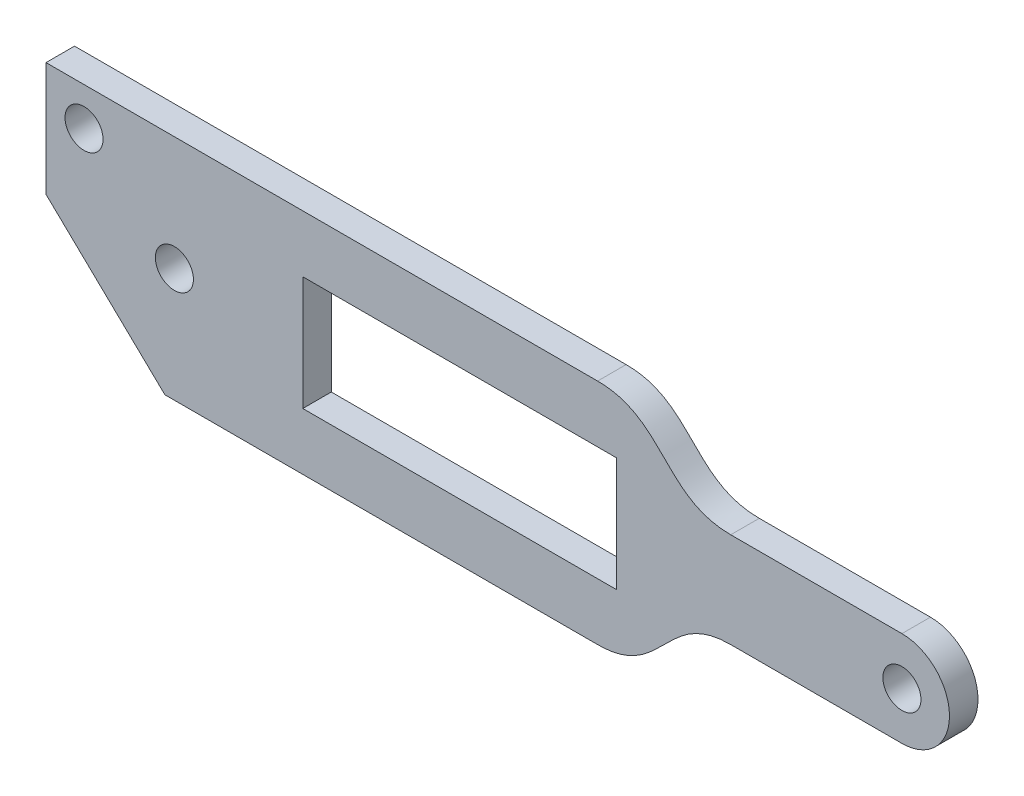
ISO-10303-21;
HEADER;
FILE_DESCRIPTION(('STEP AP214'),'2;1');
FILE_NAME('part.step','',(''),(''),'','','');
FILE_SCHEMA(('AUTOMOTIVE_DESIGN { 1 0 10303 214 1 1 1 1 }'));
ENDSEC;
DATA;
#1=APPLICATION_CONTEXT('core data for automotive mechanical design processes');
#2=APPLICATION_PROTOCOL_DEFINITION('international standard','automotive_design',2000,#1);
#3=PRODUCT_CONTEXT('',#1,'mechanical');
#4=PRODUCT('Part','Part','',(#3));
#5=PRODUCT_RELATED_PRODUCT_CATEGORY('part','',(#4));
#6=PRODUCT_DEFINITION_FORMATION('','',#4);
#7=PRODUCT_DEFINITION_CONTEXT('part definition',#1,'design');
#8=PRODUCT_DEFINITION('design','',#6,#7);
#9=PRODUCT_DEFINITION_SHAPE('','',#8);
#10=(LENGTH_UNIT() NAMED_UNIT(*) SI_UNIT(.MILLI.,.METRE.));
#11=(NAMED_UNIT(*) PLANE_ANGLE_UNIT() SI_UNIT($,.RADIAN.));
#12=(NAMED_UNIT(*) SI_UNIT($,.STERADIAN.) SOLID_ANGLE_UNIT());
#13=UNCERTAINTY_MEASURE_WITH_UNIT(LENGTH_MEASURE(1.E-05),#10,'distance_accuracy_value','');
#14=(GEOMETRIC_REPRESENTATION_CONTEXT(3) GLOBAL_UNCERTAINTY_ASSIGNED_CONTEXT((#13)) GLOBAL_UNIT_ASSIGNED_CONTEXT((#10,
#11,#12)) REPRESENTATION_CONTEXT('',''));
#15=CARTESIAN_POINT('',(0.,0.,0.));
#16=DIRECTION('',(0.,0.,1.));
#17=DIRECTION('',(1.,0.,0.));
#18=AXIS2_PLACEMENT_3D('',#15,#16,#17);
#19=CARTESIAN_POINT('',(0.,5.99999999999999,3.));
#20=DIRECTION('',(0.,1.,0.));
#21=DIRECTION('',(0.,0.,1.));
#22=AXIS2_PLACEMENT_3D('',#19,#20,#21);
#23=PLANE('',#22);
#24=DIRECTION('',(1.,0.,0.));
#25=VECTOR('',#24,1.);
#26=CARTESIAN_POINT('',(0.,5.99999999999999,0.));
#27=LINE('',#26,#25);
#28=CARTESIAN_POINT('',(-20.5,5.99999999999999,0.));
#29=VERTEX_POINT('',#28);
#30=CARTESIAN_POINT('',(12.5,5.99999999999999,0.));
#31=VERTEX_POINT('',#30);
#32=EDGE_CURVE('E206',#29,#31,#27,.T.);
#33=ORIENTED_EDGE('',*,*,#32,.T.);
#34=DIRECTION('',(0.,0.,-1.));
#35=VECTOR('',#34,1.);
#36=CARTESIAN_POINT('',(12.5,5.99999999999999,3.));
#37=LINE('',#36,#35);
#38=CARTESIAN_POINT('',(12.5,5.99999999999999,3.));
#39=VERTEX_POINT('',#38);
#40=EDGE_CURVE('E11',#39,#31,#37,.T.);
#41=ORIENTED_EDGE('',*,*,#40,.F.);
#42=DIRECTION('',(1.,0.,0.));
#43=VECTOR('',#42,1.);
#44=CARTESIAN_POINT('',(0.,5.99999999999999,3.));
#45=LINE('',#44,#43);
#46=CARTESIAN_POINT('',(-20.5,5.99999999999999,3.));
#47=VERTEX_POINT('',#46);
#48=EDGE_CURVE('E146',#47,#39,#45,.T.);
#49=ORIENTED_EDGE('',*,*,#48,.F.);
#50=DIRECTION('',(0.,0.,-1.));
#51=VECTOR('',#50,1.);
#52=CARTESIAN_POINT('',(-20.5,5.99999999999999,3.));
#53=LINE('',#52,#51);
#54=EDGE_CURVE('E55',#47,#29,#53,.T.);
#55=ORIENTED_EDGE('',*,*,#54,.T.);
#56=EDGE_LOOP('',(#33,#41,#49,#55));
#57=FACE_BOUND('',#56,.T.);
#58=ADVANCED_FACE('F35',(#57),#23,.F.);
#59=CARTESIAN_POINT('',(12.5,0.,3.));
#60=DIRECTION('',(1.,0.,0.));
#61=DIRECTION('',(0.,1.,0.));
#62=AXIS2_PLACEMENT_3D('',#59,#60,#61);
#63=PLANE('',#62);
#64=DIRECTION('',(0.,-1.,0.));
#65=VECTOR('',#64,1.);
#66=CARTESIAN_POINT('',(12.5,0.,0.));
#67=LINE('',#66,#65);
#68=CARTESIAN_POINT('',(12.5,-6.00000000000001,0.));
#69=VERTEX_POINT('',#68);
#70=EDGE_CURVE('E152',#31,#69,#67,.T.);
#71=ORIENTED_EDGE('',*,*,#70,.T.);
#72=DIRECTION('',(0.,0.,-1.));
#73=VECTOR('',#72,1.);
#74=CARTESIAN_POINT('',(12.5,-6.00000000000001,3.));
#75=LINE('',#74,#73);
#76=CARTESIAN_POINT('',(12.5,-6.00000000000001,3.));
#77=VERTEX_POINT('',#76);
#78=EDGE_CURVE('E46',#77,#69,#75,.T.);
#79=ORIENTED_EDGE('',*,*,#78,.F.);
#80=DIRECTION('',(0.,-1.,0.));
#81=VECTOR('',#80,1.);
#82=CARTESIAN_POINT('',(12.5,0.,3.));
#83=LINE('',#82,#81);
#84=EDGE_CURVE('E139',#39,#77,#83,.T.);
#85=ORIENTED_EDGE('',*,*,#84,.F.);
#86=ORIENTED_EDGE('',*,*,#40,.T.);
#87=EDGE_LOOP('',(#71,#79,#85,#86));
#88=FACE_BOUND('',#87,.T.);
#89=ADVANCED_FACE('F151',(#88),#63,.F.);
#90=CARTESIAN_POINT('',(0.,-6.00000000000001,3.));
#91=DIRECTION('',(0.,1.,0.));
#92=DIRECTION('',(0.,0.,1.));
#93=AXIS2_PLACEMENT_3D('',#90,#91,#92);
#94=PLANE('',#93);
#95=DIRECTION('',(1.,0.,0.));
#96=VECTOR('',#95,1.);
#97=CARTESIAN_POINT('',(0.,-6.00000000000001,0.));
#98=LINE('',#97,#96);
#99=CARTESIAN_POINT('',(-20.5,-6.00000000000001,0.));
#100=VERTEX_POINT('',#99);
#101=EDGE_CURVE('E209',#100,#69,#98,.T.);
#102=ORIENTED_EDGE('',*,*,#101,.F.);
#103=DIRECTION('',(0.,0.,-1.));
#104=VECTOR('',#103,1.);
#105=CARTESIAN_POINT('',(-20.5,-6.00000000000001,3.));
#106=LINE('',#105,#104);
#107=CARTESIAN_POINT('',(-20.5,-6.00000000000001,3.));
#108=VERTEX_POINT('',#107);
#109=EDGE_CURVE('E96',#108,#100,#106,.T.);
#110=ORIENTED_EDGE('',*,*,#109,.F.);
#111=DIRECTION('',(1.,0.,0.));
#112=VECTOR('',#111,1.);
#113=CARTESIAN_POINT('',(0.,-6.00000000000001,3.));
#114=LINE('',#113,#112);
#115=EDGE_CURVE('E145',#108,#77,#114,.T.);
#116=ORIENTED_EDGE('',*,*,#115,.T.);
#117=ORIENTED_EDGE('',*,*,#78,.T.);
#118=EDGE_LOOP('',(#102,#110,#116,#117));
#119=FACE_BOUND('',#118,.T.);
#120=ADVANCED_FACE('F156',(#119),#94,.T.);
#121=CARTESIAN_POINT('',(24.5,-5.,3.));
#122=CARTESIAN_POINT('',(17.5,-5.,3.));
#123=CARTESIAN_POINT('',(17.5,-12.,3.));
#124=CARTESIAN_POINT('',(10.5,-12.,3.));
#125=B_SPLINE_CURVE_WITH_KNOTS('',3,(#121,#122,#123,#124),.UNSPECIFIED.,.F.,.F.,(4,4),(0.,1.),.UNSPECIFIED.);
#126=DIRECTION('',(0.,0.,-1.));
#127=VECTOR('',#126,1.);
#128=SURFACE_OF_LINEAR_EXTRUSION('',#125,#127);
#129=CARTESIAN_POINT('',(24.5,-5.,0.));
#130=CARTESIAN_POINT('',(17.5,-5.,0.));
#131=CARTESIAN_POINT('',(17.5,-12.,0.));
#132=CARTESIAN_POINT('',(10.5,-12.,0.));
#133=B_SPLINE_CURVE_WITH_KNOTS('',3,(#129,#130,#131,#132),.UNSPECIFIED.,.F.,.F.,(4,4),(0.,1.),.UNSPECIFIED.);
#134=CARTESIAN_POINT('',(24.5,-5.,0.));
#135=VERTEX_POINT('',#134);
#136=CARTESIAN_POINT('',(10.5,-12.,0.));
#137=VERTEX_POINT('',#136);
#138=EDGE_CURVE('E166',#135,#137,#133,.T.);
#139=ORIENTED_EDGE('',*,*,#138,.F.);
#140=DIRECTION('',(0.,0.,-1.));
#141=VECTOR('',#140,1.);
#142=CARTESIAN_POINT('',(24.5,-5.,3.));
#143=LINE('',#142,#141);
#144=CARTESIAN_POINT('',(24.5,-5.,3.));
#145=VERTEX_POINT('',#144);
#146=EDGE_CURVE('E40',#145,#135,#143,.T.);
#147=ORIENTED_EDGE('',*,*,#146,.F.);
#148=CARTESIAN_POINT('',(10.5,-12.,3.));
#149=VERTEX_POINT('',#148);
#150=EDGE_CURVE('E217',#145,#149,#125,.T.);
#151=ORIENTED_EDGE('',*,*,#150,.T.);
#152=DIRECTION('',(0.,0.,-1.));
#153=VECTOR('',#152,1.);
#154=CARTESIAN_POINT('',(10.5,-12.,3.));
#155=LINE('',#154,#153);
#156=EDGE_CURVE('E165',#149,#137,#155,.T.);
#157=ORIENTED_EDGE('',*,*,#156,.T.);
#158=EDGE_LOOP('',(#139,#147,#151,#157));
#159=FACE_BOUND('',#158,.T.);
#160=ADVANCED_FACE('F37',(#159),#128,.T.);
#161=CARTESIAN_POINT('',(0.,-5.,3.));
#162=DIRECTION('',(0.,-1.,0.));
#163=DIRECTION('',(1.,0.,0.));
#164=AXIS2_PLACEMENT_3D('',#161,#162,#163);
#165=PLANE('',#164);
#166=DIRECTION('',(-1.,0.,0.));
#167=VECTOR('',#166,1.);
#168=CARTESIAN_POINT('',(0.,-5.,0.));
#169=LINE('',#168,#167);
#170=CARTESIAN_POINT('',(42.5,-5.,0.));
#171=VERTEX_POINT('',#170);
#172=EDGE_CURVE('E171',#171,#135,#169,.T.);
#173=ORIENTED_EDGE('',*,*,#172,.F.);
#174=DIRECTION('',(0.,0.,-1.));
#175=VECTOR('',#174,1.);
#176=CARTESIAN_POINT('',(42.5,-5.,3.));
#177=LINE('',#176,#175);
#178=CARTESIAN_POINT('',(42.5,-5.,3.));
#179=VERTEX_POINT('',#178);
#180=EDGE_CURVE('E235',#179,#171,#177,.T.);
#181=ORIENTED_EDGE('',*,*,#180,.F.);
#182=DIRECTION('',(-1.,0.,0.));
#183=VECTOR('',#182,1.);
#184=CARTESIAN_POINT('',(0.,-5.,3.));
#185=LINE('',#184,#183);
#186=EDGE_CURVE('E244',#179,#145,#185,.T.);
#187=ORIENTED_EDGE('',*,*,#186,.T.);
#188=ORIENTED_EDGE('',*,*,#146,.T.);
#189=EDGE_LOOP('',(#173,#181,#187,#188));
#190=FACE_BOUND('',#189,.T.);
#191=ADVANCED_FACE('F242',(#190),#165,.T.);
#192=CARTESIAN_POINT('',(42.5,0.,3.));
#193=DIRECTION('',(0.,0.,-1.));
#194=DIRECTION('',(-1.,0.,0.));
#195=AXIS2_PLACEMENT_3D('',#192,#193,#194);
#196=CYLINDRICAL_SURFACE('',#195,5.);
#197=CARTESIAN_POINT('',(42.5,0.,0.));
#198=DIRECTION('',(0.,0.,1.));
#199=DIRECTION('',(1.,0.,0.));
#200=AXIS2_PLACEMENT_3D('',#197,#198,#199);
#201=CIRCLE('',#200,5.);
#202=CARTESIAN_POINT('',(42.5,5.,0.));
#203=VERTEX_POINT('',#202);
#204=EDGE_CURVE('E177',#171,#203,#201,.T.);
#205=ORIENTED_EDGE('',*,*,#204,.T.);
#206=DIRECTION('',(0.,0.,-1.));
#207=VECTOR('',#206,1.);
#208=CARTESIAN_POINT('',(42.5,5.,3.));
#209=LINE('',#208,#207);
#210=CARTESIAN_POINT('',(42.5,5.,3.));
#211=VERTEX_POINT('',#210);
#212=EDGE_CURVE('E233',#211,#203,#209,.T.);
#213=ORIENTED_EDGE('',*,*,#212,.F.);
#214=CARTESIAN_POINT('',(42.5,0.,3.));
#215=DIRECTION('',(0.,0.,1.));
#216=DIRECTION('',(1.,0.,0.));
#217=AXIS2_PLACEMENT_3D('',#214,#215,#216);
#218=CIRCLE('',#217,5.);
#219=EDGE_CURVE('E261',#179,#211,#218,.T.);
#220=ORIENTED_EDGE('',*,*,#219,.F.);
#221=ORIENTED_EDGE('',*,*,#180,.T.);
#222=EDGE_LOOP('',(#205,#213,#220,#221));
#223=FACE_BOUND('',#222,.T.);
#224=ADVANCED_FACE('F252',(#223),#196,.T.);
#225=CARTESIAN_POINT('',(0.,5.,3.));
#226=DIRECTION('',(0.,-1.,0.));
#227=DIRECTION('',(1.,0.,0.));
#228=AXIS2_PLACEMENT_3D('',#225,#226,#227);
#229=PLANE('',#228);
#230=DIRECTION('',(-1.,0.,0.));
#231=VECTOR('',#230,1.);
#232=CARTESIAN_POINT('',(0.,5.,0.));
#233=LINE('',#232,#231);
#234=CARTESIAN_POINT('',(24.5,5.,0.));
#235=VERTEX_POINT('',#234);
#236=EDGE_CURVE('E179',#203,#235,#233,.T.);
#237=ORIENTED_EDGE('',*,*,#236,.T.);
#238=DIRECTION('',(0.,0.,-1.));
#239=VECTOR('',#238,1.);
#240=CARTESIAN_POINT('',(24.5,5.,3.));
#241=LINE('',#240,#239);
#242=CARTESIAN_POINT('',(24.5,5.,3.));
#243=VERTEX_POINT('',#242);
#244=EDGE_CURVE('E230',#243,#235,#241,.T.);
#245=ORIENTED_EDGE('',*,*,#244,.F.);
#246=DIRECTION('',(-1.,0.,0.));
#247=VECTOR('',#246,1.);
#248=CARTESIAN_POINT('',(0.,5.,3.));
#249=LINE('',#248,#247);
#250=EDGE_CURVE('E257',#211,#243,#249,.T.);
#251=ORIENTED_EDGE('',*,*,#250,.F.);
#252=ORIENTED_EDGE('',*,*,#212,.T.);
#253=EDGE_LOOP('',(#237,#245,#251,#252));
#254=FACE_BOUND('',#253,.T.);
#255=ADVANCED_FACE('F255',(#254),#229,.F.);
#256=CARTESIAN_POINT('',(24.5,5.,3.));
#257=CARTESIAN_POINT('',(17.5,5.,3.));
#258=CARTESIAN_POINT('',(17.5,12.,3.));
#259=CARTESIAN_POINT('',(10.5,12.,3.));
#260=B_SPLINE_CURVE_WITH_KNOTS('',3,(#256,#257,#258,#259),.UNSPECIFIED.,.F.,.F.,(4,4),(0.,1.),.UNSPECIFIED.);
#261=DIRECTION('',(0.,0.,-1.));
#262=VECTOR('',#261,1.);
#263=SURFACE_OF_LINEAR_EXTRUSION('',#260,#262);
#264=CARTESIAN_POINT('',(24.5,5.,0.));
#265=CARTESIAN_POINT('',(17.5,5.,0.));
#266=CARTESIAN_POINT('',(17.5,12.,0.));
#267=CARTESIAN_POINT('',(10.5,12.,0.));
#268=B_SPLINE_CURVE_WITH_KNOTS('',3,(#264,#265,#266,#267),.UNSPECIFIED.,.F.,.F.,(4,4),(0.,1.),.UNSPECIFIED.);
#269=CARTESIAN_POINT('',(10.5,12.,0.));
#270=VERTEX_POINT('',#269);
#271=EDGE_CURVE('E181',#235,#270,#268,.T.);
#272=ORIENTED_EDGE('',*,*,#271,.T.);
#273=DIRECTION('',(0.,0.,-1.));
#274=VECTOR('',#273,1.);
#275=CARTESIAN_POINT('',(10.5,12.,3.));
#276=LINE('',#275,#274);
#277=CARTESIAN_POINT('',(10.5,12.,3.));
#278=VERTEX_POINT('',#277);
#279=EDGE_CURVE('E227',#278,#270,#276,.T.);
#280=ORIENTED_EDGE('',*,*,#279,.F.);
#281=EDGE_CURVE('E260',#243,#278,#260,.T.);
#282=ORIENTED_EDGE('',*,*,#281,.F.);
#283=ORIENTED_EDGE('',*,*,#244,.T.);
#284=EDGE_LOOP('',(#272,#280,#282,#283));
#285=FACE_BOUND('',#284,.T.);
#286=ADVANCED_FACE('F276',(#285),#263,.F.);
#287=CARTESIAN_POINT('',(0.,12.,3.));
#288=DIRECTION('',(0.,-1.,0.));
#289=DIRECTION('',(1.,0.,0.));
#290=AXIS2_PLACEMENT_3D('',#287,#288,#289);
#291=PLANE('',#290);
#292=DIRECTION('',(-1.,0.,0.));
#293=VECTOR('',#292,1.);
#294=CARTESIAN_POINT('',(0.,12.,0.));
#295=LINE('',#294,#293);
#296=CARTESIAN_POINT('',(-47.5,12.,0.));
#297=VERTEX_POINT('',#296);
#298=EDGE_CURVE('E185',#270,#297,#295,.T.);
#299=ORIENTED_EDGE('',*,*,#298,.T.);
#300=DIRECTION('',(0.,0.,-1.));
#301=VECTOR('',#300,1.);
#302=CARTESIAN_POINT('',(-47.5,12.,3.));
#303=LINE('',#302,#301);
#304=CARTESIAN_POINT('',(-47.5,12.,3.));
#305=VERTEX_POINT('',#304);
#306=EDGE_CURVE('E225',#305,#297,#303,.T.);
#307=ORIENTED_EDGE('',*,*,#306,.F.);
#308=DIRECTION('',(-1.,0.,0.));
#309=VECTOR('',#308,1.);
#310=CARTESIAN_POINT('',(0.,12.,3.));
#311=LINE('',#310,#309);
#312=EDGE_CURVE('E263',#278,#305,#311,.T.);
#313=ORIENTED_EDGE('',*,*,#312,.F.);
#314=ORIENTED_EDGE('',*,*,#279,.T.);
#315=EDGE_LOOP('',(#299,#307,#313,#314));
#316=FACE_BOUND('',#315,.T.);
#317=ADVANCED_FACE('F280',(#316),#291,.F.);
#318=CARTESIAN_POINT('',(-47.5,0.,3.));
#319=DIRECTION('',(-1.,0.,0.));
#320=DIRECTION('',(0.,0.,1.));
#321=AXIS2_PLACEMENT_3D('',#318,#319,#320);
#322=PLANE('',#321);
#323=DIRECTION('',(0.,1.,0.));
#324=VECTOR('',#323,1.);
#325=CARTESIAN_POINT('',(-47.5,0.,0.));
#326=LINE('',#325,#324);
#327=CARTESIAN_POINT('',(-47.5,0.,0.));
#328=VERTEX_POINT('',#327);
#329=EDGE_CURVE('E191',#328,#297,#326,.T.);
#330=ORIENTED_EDGE('',*,*,#329,.F.);
#331=DIRECTION('',(0.,0.,-1.));
#332=VECTOR('',#331,1.);
#333=CARTESIAN_POINT('',(-47.5,0.,3.));
#334=LINE('',#333,#332);
#335=CARTESIAN_POINT('',(-47.5,0.,3.));
#336=VERTEX_POINT('',#335);
#337=EDGE_CURVE('E223',#336,#328,#334,.T.);
#338=ORIENTED_EDGE('',*,*,#337,.F.);
#339=DIRECTION('',(0.,1.,0.));
#340=VECTOR('',#339,1.);
#341=CARTESIAN_POINT('',(-47.5,0.,3.));
#342=LINE('',#341,#340);
#343=EDGE_CURVE('E334',#336,#305,#342,.T.);
#344=ORIENTED_EDGE('',*,*,#343,.T.);
#345=ORIENTED_EDGE('',*,*,#306,.T.);
#346=EDGE_LOOP('',(#330,#338,#344,#345));
#347=FACE_BOUND('',#346,.T.);
#348=ADVANCED_FACE('F314',(#347),#322,.T.);
#349=CARTESIAN_POINT('',(-22.7810158201493,-23.7302248126561,3.));
#350=DIRECTION('',(0.692531828189704,0.72138732103096,0.));
#351=DIRECTION('',(-0.72138732103096,0.692531828189704,0.));
#352=AXIS2_PLACEMENT_3D('',#349,#350,#351);
#353=PLANE('',#352);
#354=DIRECTION('',(0.72138732103096,-0.692531828189704,0.));
#355=VECTOR('',#354,1.);
#356=CARTESIAN_POINT('',(-22.7810158201493,-23.7302248126561,0.));
#357=LINE('',#356,#355);
#358=CARTESIAN_POINT('',(-34.9999999999997,-12.,0.));
#359=VERTEX_POINT('',#358);
#360=EDGE_CURVE('E194',#328,#359,#357,.T.);
#361=ORIENTED_EDGE('',*,*,#360,.T.);
#362=DIRECTION('',(0.,0.,-1.));
#363=VECTOR('',#362,1.);
#364=CARTESIAN_POINT('',(-34.9999999999997,-12.,3.));
#365=LINE('',#364,#363);
#366=CARTESIAN_POINT('',(-34.9999999999997,-12.,3.));
#367=VERTEX_POINT('',#366);
#368=EDGE_CURVE('E221',#367,#359,#365,.T.);
#369=ORIENTED_EDGE('',*,*,#368,.F.);
#370=DIRECTION('',(0.72138732103096,-0.692531828189704,0.));
#371=VECTOR('',#370,1.);
#372=CARTESIAN_POINT('',(-22.7810158201493,-23.7302248126561,3.));
#373=LINE('',#372,#371);
#374=EDGE_CURVE('E330',#336,#367,#373,.T.);
#375=ORIENTED_EDGE('',*,*,#374,.F.);
#376=ORIENTED_EDGE('',*,*,#337,.T.);
#377=EDGE_LOOP('',(#361,#369,#375,#376));
#378=FACE_BOUND('',#377,.T.);
#379=ADVANCED_FACE('F312',(#378),#353,.F.);
#380=CARTESIAN_POINT('',(-20.5,0.,3.));
#381=DIRECTION('',(1.,0.,0.));
#382=DIRECTION('',(0.,1.,0.));
#383=AXIS2_PLACEMENT_3D('',#380,#381,#382);
#384=PLANE('',#383);
#385=DIRECTION('',(0.,-1.,0.));
#386=VECTOR('',#385,1.);
#387=CARTESIAN_POINT('',(-20.5,0.,0.));
#388=LINE('',#387,#386);
#389=EDGE_CURVE('E211',#29,#100,#388,.T.);
#390=ORIENTED_EDGE('',*,*,#389,.F.);
#391=ORIENTED_EDGE('',*,*,#54,.F.);
#392=DIRECTION('',(0.,-1.,0.));
#393=VECTOR('',#392,1.);
#394=CARTESIAN_POINT('',(-20.5,0.,3.));
#395=LINE('',#394,#393);
#396=EDGE_CURVE('E157',#47,#108,#395,.T.);
#397=ORIENTED_EDGE('',*,*,#396,.T.);
#398=ORIENTED_EDGE('',*,*,#109,.T.);
#399=EDGE_LOOP('',(#390,#391,#397,#398));
#400=FACE_BOUND('',#399,.T.);
#401=ADVANCED_FACE('F302',(#400),#384,.T.);
#402=CARTESIAN_POINT('',(-34.,0.,3.));
#403=DIRECTION('',(0.,0.,-1.));
#404=DIRECTION('',(-1.,0.,0.));
#405=AXIS2_PLACEMENT_3D('',#402,#403,#404);
#406=CYLINDRICAL_SURFACE('',#405,2.);
#407=CARTESIAN_POINT('',(-34.,0.,3.));
#408=DIRECTION('',(0.,0.,1.));
#409=DIRECTION('',(1.,0.,0.));
#410=AXIS2_PLACEMENT_3D('',#407,#408,#409);
#411=CIRCLE('',#410,2.);
#412=CARTESIAN_POINT('',(-32.,0.,3.));
#413=VERTEX_POINT('',#412);
#414=EDGE_CURVE('E343',#413,#413,#411,.T.);
#415=ORIENTED_EDGE('',*,*,#414,.T.);
#416=EDGE_LOOP('',(#415));
#417=FACE_BOUND('',#416,.T.);
#418=CARTESIAN_POINT('',(-34.,0.,0.));
#419=DIRECTION('',(0.,0.,1.));
#420=DIRECTION('',(1.,0.,0.));
#421=AXIS2_PLACEMENT_3D('',#418,#419,#420);
#422=CIRCLE('',#421,2.);
#423=CARTESIAN_POINT('',(-32.,0.,0.));
#424=VERTEX_POINT('',#423);
#425=EDGE_CURVE('E203',#424,#424,#422,.T.);
#426=ORIENTED_EDGE('',*,*,#425,.F.);
#427=EDGE_LOOP('',(#426));
#428=FACE_BOUND('',#427,.T.);
#429=ADVANCED_FACE('F298',(#417,#428),#406,.F.);
#430=CARTESIAN_POINT('',(-43.5,7.99999999999997,3.));
#431=DIRECTION('',(0.,0.,-1.));
#432=DIRECTION('',(-1.,0.,0.));
#433=AXIS2_PLACEMENT_3D('',#430,#431,#432);
#434=CYLINDRICAL_SURFACE('',#433,2.);
#435=CARTESIAN_POINT('',(-43.5,7.99999999999997,3.));
#436=DIRECTION('',(0.,0.,1.));
#437=DIRECTION('',(1.,0.,0.));
#438=AXIS2_PLACEMENT_3D('',#435,#436,#437);
#439=CIRCLE('',#438,2.);
#440=CARTESIAN_POINT('',(-41.5,7.99999999999997,3.));
#441=VERTEX_POINT('',#440);
#442=EDGE_CURVE('E340',#441,#441,#439,.T.);
#443=ORIENTED_EDGE('',*,*,#442,.T.);
#444=EDGE_LOOP('',(#443));
#445=FACE_BOUND('',#444,.T.);
#446=CARTESIAN_POINT('',(-43.5,7.99999999999997,0.));
#447=DIRECTION('',(0.,0.,1.));
#448=DIRECTION('',(1.,0.,0.));
#449=AXIS2_PLACEMENT_3D('',#446,#447,#448);
#450=CIRCLE('',#449,2.);
#451=CARTESIAN_POINT('',(-41.5,7.99999999999997,0.));
#452=VERTEX_POINT('',#451);
#453=EDGE_CURVE('E200',#452,#452,#450,.T.);
#454=ORIENTED_EDGE('',*,*,#453,.F.);
#455=EDGE_LOOP('',(#454));
#456=FACE_BOUND('',#455,.T.);
#457=ADVANCED_FACE('F301',(#445,#456),#434,.F.);
#458=CARTESIAN_POINT('',(0.,-12.,3.));
#459=DIRECTION('',(0.,-1.,0.));
#460=DIRECTION('',(1.,0.,0.));
#461=AXIS2_PLACEMENT_3D('',#458,#459,#460);
#462=PLANE('',#461);
#463=DIRECTION('',(-1.,0.,0.));
#464=VECTOR('',#463,1.);
#465=CARTESIAN_POINT('',(0.,-12.,0.));
#466=LINE('',#465,#464);
#467=EDGE_CURVE('E197',#137,#359,#466,.T.);
#468=ORIENTED_EDGE('',*,*,#467,.F.);
#469=ORIENTED_EDGE('',*,*,#156,.F.);
#470=DIRECTION('',(-1.,0.,0.));
#471=VECTOR('',#470,1.);
#472=CARTESIAN_POINT('',(0.,-12.,3.));
#473=LINE('',#472,#471);
#474=EDGE_CURVE('E333',#149,#367,#473,.T.);
#475=ORIENTED_EDGE('',*,*,#474,.T.);
#476=ORIENTED_EDGE('',*,*,#368,.T.);
#477=EDGE_LOOP('',(#468,#469,#475,#476));
#478=FACE_BOUND('',#477,.T.);
#479=ADVANCED_FACE('F306',(#478),#462,.T.);
#480=CARTESIAN_POINT('',(42.5,0.,3.));
#481=DIRECTION('',(0.,0.,-1.));
#482=DIRECTION('',(-1.,0.,0.));
#483=AXIS2_PLACEMENT_3D('',#480,#481,#482);
#484=CYLINDRICAL_SURFACE('',#483,2.);
#485=CARTESIAN_POINT('',(42.5,0.,3.));
#486=DIRECTION('',(0.,0.,1.));
#487=DIRECTION('',(1.,0.,0.));
#488=AXIS2_PLACEMENT_3D('',#485,#486,#487);
#489=CIRCLE('',#488,2.);
#490=CARTESIAN_POINT('',(44.5,0.,3.));
#491=VERTEX_POINT('',#490);
#492=EDGE_CURVE('E159',#491,#491,#489,.T.);
#493=ORIENTED_EDGE('',*,*,#492,.T.);
#494=EDGE_LOOP('',(#493));
#495=FACE_BOUND('',#494,.T.);
#496=CARTESIAN_POINT('',(42.5,0.,0.));
#497=DIRECTION('',(0.,0.,1.));
#498=DIRECTION('',(1.,0.,0.));
#499=AXIS2_PLACEMENT_3D('',#496,#497,#498);
#500=CIRCLE('',#499,2.);
#501=CARTESIAN_POINT('',(44.5,0.,0.));
#502=VERTEX_POINT('',#501);
#503=EDGE_CURVE('E214',#502,#502,#500,.T.);
#504=ORIENTED_EDGE('',*,*,#503,.F.);
#505=EDGE_LOOP('',(#504));
#506=FACE_BOUND('',#505,.T.);
#507=ADVANCED_FACE('F310',(#495,#506),#484,.F.);
#508=CARTESIAN_POINT('',(0.,0.,3.));
#509=DIRECTION('',(0.,0.,1.));
#510=DIRECTION('',(1.,0.,0.));
#511=AXIS2_PLACEMENT_3D('',#508,#509,#510);
#512=PLANE('',#511);
#513=ORIENTED_EDGE('',*,*,#150,.F.);
#514=ORIENTED_EDGE('',*,*,#186,.F.);
#515=ORIENTED_EDGE('',*,*,#219,.T.);
#516=ORIENTED_EDGE('',*,*,#250,.T.);
#517=ORIENTED_EDGE('',*,*,#281,.T.);
#518=ORIENTED_EDGE('',*,*,#312,.T.);
#519=ORIENTED_EDGE('',*,*,#343,.F.);
#520=ORIENTED_EDGE('',*,*,#374,.T.);
#521=ORIENTED_EDGE('',*,*,#474,.F.);
#522=EDGE_LOOP('',(#513,#514,#515,#516,#517,#518,#519,#520,#521));
#523=FACE_BOUND('',#522,.T.);
#524=ORIENTED_EDGE('',*,*,#442,.F.);
#525=EDGE_LOOP('',(#524));
#526=FACE_BOUND('',#525,.T.);
#527=ORIENTED_EDGE('',*,*,#414,.F.);
#528=EDGE_LOOP('',(#527));
#529=FACE_BOUND('',#528,.T.);
#530=ORIENTED_EDGE('',*,*,#48,.T.);
#531=ORIENTED_EDGE('',*,*,#84,.T.);
#532=ORIENTED_EDGE('',*,*,#115,.F.);
#533=ORIENTED_EDGE('',*,*,#396,.F.);
#534=EDGE_LOOP('',(#530,#531,#532,#533));
#535=FACE_BOUND('',#534,.T.);
#536=ORIENTED_EDGE('',*,*,#492,.F.);
#537=EDGE_LOOP('',(#536));
#538=FACE_BOUND('',#537,.T.);
#539=ADVANCED_FACE('F141',(#523,#526,#529,#535,#538),#512,.T.);
#540=CARTESIAN_POINT('',(0.,0.,0.));
#541=DIRECTION('',(0.,0.,1.));
#542=DIRECTION('',(1.,0.,0.));
#543=AXIS2_PLACEMENT_3D('',#540,#541,#542);
#544=PLANE('',#543);
#545=ORIENTED_EDGE('',*,*,#138,.T.);
#546=ORIENTED_EDGE('',*,*,#467,.T.);
#547=ORIENTED_EDGE('',*,*,#360,.F.);
#548=ORIENTED_EDGE('',*,*,#329,.T.);
#549=ORIENTED_EDGE('',*,*,#298,.F.);
#550=ORIENTED_EDGE('',*,*,#271,.F.);
#551=ORIENTED_EDGE('',*,*,#236,.F.);
#552=ORIENTED_EDGE('',*,*,#204,.F.);
#553=ORIENTED_EDGE('',*,*,#172,.T.);
#554=EDGE_LOOP('',(#545,#546,#547,#548,#549,#550,#551,#552,#553));
#555=FACE_BOUND('',#554,.T.);
#556=ORIENTED_EDGE('',*,*,#453,.T.);
#557=EDGE_LOOP('',(#556));
#558=FACE_BOUND('',#557,.T.);
#559=ORIENTED_EDGE('',*,*,#425,.T.);
#560=EDGE_LOOP('',(#559));
#561=FACE_BOUND('',#560,.T.);
#562=ORIENTED_EDGE('',*,*,#32,.F.);
#563=ORIENTED_EDGE('',*,*,#389,.T.);
#564=ORIENTED_EDGE('',*,*,#101,.T.);
#565=ORIENTED_EDGE('',*,*,#70,.F.);
#566=EDGE_LOOP('',(#562,#563,#564,#565));
#567=FACE_BOUND('',#566,.T.);
#568=ORIENTED_EDGE('',*,*,#503,.T.);
#569=EDGE_LOOP('',(#568));
#570=FACE_BOUND('',#569,.T.);
#571=ADVANCED_FACE('F247',(#555,#558,#561,#567,#570),#544,.F.);
#572=CLOSED_SHELL('',(#58,#89,#120,#160,#191,#224,#255,#286,#317,#348,#379,#401,#429,#457,#479,
#507,#539,#571));
#573=MANIFOLD_SOLID_BREP('B2',#572);
#574=ADVANCED_BREP_SHAPE_REPRESENTATION('',(#18,#573),#14);
#575=SHAPE_DEFINITION_REPRESENTATION(#9,#574);
ENDSEC;
END-ISO-10303-21;
